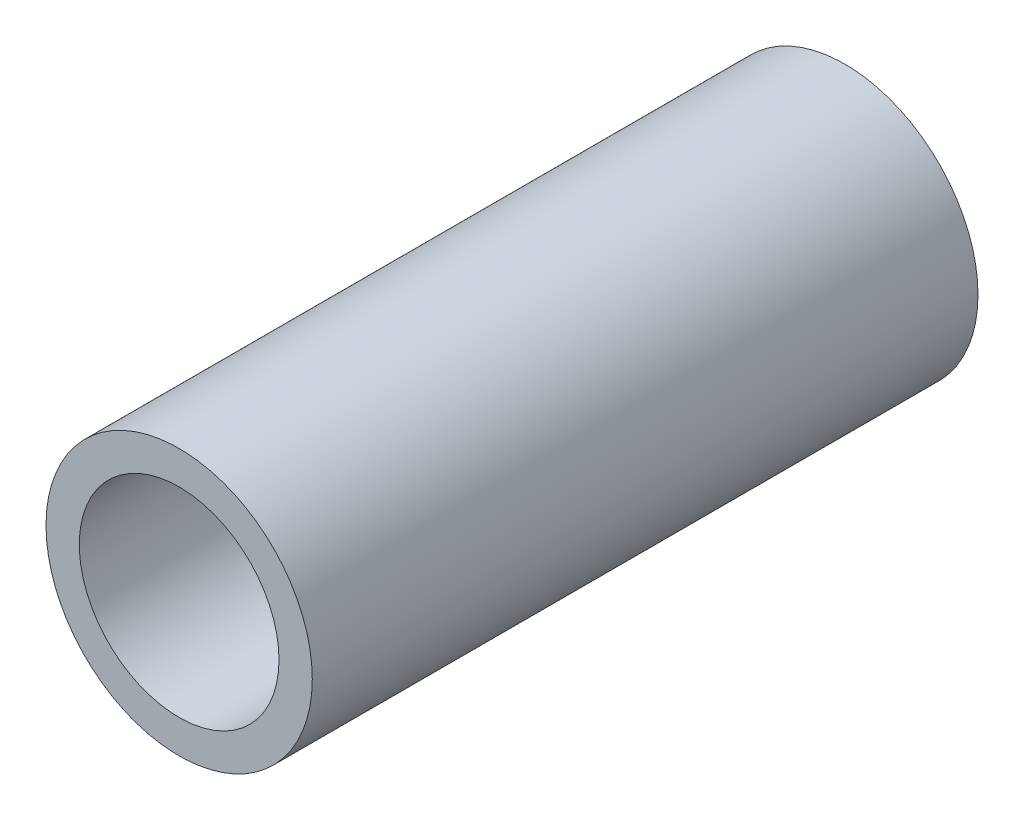
ISO-10303-21;
HEADER;
FILE_DESCRIPTION(('STEP AP214'),'2;1');
FILE_NAME('part.step','',(''),(''),'','','');
FILE_SCHEMA(('AUTOMOTIVE_DESIGN { 1 0 10303 214 1 1 1 1 }'));
ENDSEC;
DATA;
#1=APPLICATION_CONTEXT('core data for automotive mechanical design processes');
#2=APPLICATION_PROTOCOL_DEFINITION('international standard','automotive_design',2000,#1);
#3=PRODUCT_CONTEXT('',#1,'mechanical');
#4=PRODUCT('Part','Part','',(#3));
#5=PRODUCT_RELATED_PRODUCT_CATEGORY('part','',(#4));
#6=PRODUCT_DEFINITION_FORMATION('','',#4);
#7=PRODUCT_DEFINITION_CONTEXT('part definition',#1,'design');
#8=PRODUCT_DEFINITION('design','',#6,#7);
#9=PRODUCT_DEFINITION_SHAPE('','',#8);
#10=(LENGTH_UNIT() NAMED_UNIT(*) SI_UNIT(.MILLI.,.METRE.));
#11=(NAMED_UNIT(*) PLANE_ANGLE_UNIT() SI_UNIT($,.RADIAN.));
#12=(NAMED_UNIT(*) SI_UNIT($,.STERADIAN.) SOLID_ANGLE_UNIT());
#13=UNCERTAINTY_MEASURE_WITH_UNIT(LENGTH_MEASURE(1.E-05),#10,'distance_accuracy_value','');
#14=(GEOMETRIC_REPRESENTATION_CONTEXT(3) GLOBAL_UNCERTAINTY_ASSIGNED_CONTEXT((#13)) GLOBAL_UNIT_ASSIGNED_CONTEXT((#10,
#11,#12)) REPRESENTATION_CONTEXT('',''));
#15=CARTESIAN_POINT('',(0.,0.,0.));
#16=DIRECTION('',(0.,0.,1.));
#17=DIRECTION('',(1.,0.,0.));
#18=AXIS2_PLACEMENT_3D('',#15,#16,#17);
#19=CARTESIAN_POINT('',(21.0196381560286,112.414161958909,343.624757540734));
#20=DIRECTION('',(0.,0.,-1.));
#21=DIRECTION('',(0.,-1.,0.));
#22=AXIS2_PLACEMENT_3D('',#19,#20,#21);
#23=PLANE('',#22);
#24=CARTESIAN_POINT('',(21.0196381560286,112.414161958909,343.624757540734));
#25=DIRECTION('',(0.,0.,1.));
#26=DIRECTION('',(1.,0.,0.));
#27=AXIS2_PLACEMENT_3D('',#24,#25,#26);
#28=CIRCLE('',#27,3.);
#29=CARTESIAN_POINT('',(24.0196381560286,112.414161958909,343.624757540734));
#30=VERTEX_POINT('',#29);
#31=EDGE_CURVE('E11',#30,#30,#28,.T.);
#32=ORIENTED_EDGE('',*,*,#31,.T.);
#33=EDGE_LOOP('',(#32));
#34=FACE_BOUND('',#33,.T.);
#35=CARTESIAN_POINT('',(21.0196381560286,112.414161958909,343.624757540734));
#36=DIRECTION('',(0.,0.,1.));
#37=DIRECTION('',(1.,0.,0.));
#38=AXIS2_PLACEMENT_3D('',#35,#36,#37);
#39=CIRCLE('',#38,4.);
#40=CARTESIAN_POINT('',(25.0196381560286,112.414161958909,343.624757540734));
#41=VERTEX_POINT('',#40);
#42=EDGE_CURVE('E47',#41,#41,#39,.T.);
#43=ORIENTED_EDGE('',*,*,#42,.F.);
#44=EDGE_LOOP('',(#43));
#45=FACE_BOUND('',#44,.T.);
#46=ADVANCED_FACE('F43',(#34,#45),#23,.T.);
#47=CARTESIAN_POINT('',(21.0196381560286,112.414161958909,363.624757540734));
#48=DIRECTION('',(0.,0.,-1.));
#49=DIRECTION('',(0.,-1.,0.));
#50=AXIS2_PLACEMENT_3D('',#47,#48,#49);
#51=PLANE('',#50);
#52=CARTESIAN_POINT('',(21.0196381560286,112.414161958909,363.624757540734));
#53=DIRECTION('',(0.,0.,1.));
#54=DIRECTION('',(1.,0.,0.));
#55=AXIS2_PLACEMENT_3D('',#52,#53,#54);
#56=CIRCLE('',#55,3.);
#57=CARTESIAN_POINT('',(24.0196381560286,112.414161958909,363.624757540734));
#58=VERTEX_POINT('',#57);
#59=EDGE_CURVE('E53',#58,#58,#56,.T.);
#60=ORIENTED_EDGE('',*,*,#59,.F.);
#61=EDGE_LOOP('',(#60));
#62=FACE_BOUND('',#61,.T.);
#63=CARTESIAN_POINT('',(21.0196381560286,112.414161958909,363.624757540734));
#64=DIRECTION('',(0.,0.,1.));
#65=DIRECTION('',(1.,0.,0.));
#66=AXIS2_PLACEMENT_3D('',#63,#64,#65);
#67=CIRCLE('',#66,4.);
#68=CARTESIAN_POINT('',(25.0196381560286,112.414161958909,363.624757540734));
#69=VERTEX_POINT('',#68);
#70=EDGE_CURVE('E65',#69,#69,#67,.T.);
#71=ORIENTED_EDGE('',*,*,#70,.T.);
#72=EDGE_LOOP('',(#71));
#73=FACE_BOUND('',#72,.T.);
#74=ADVANCED_FACE('F76',(#62,#73),#51,.F.);
#75=CARTESIAN_POINT('',(21.0196381560286,112.414161958909,363.624757540734));
#76=DIRECTION('',(0.,0.,-1.));
#77=DIRECTION('',(1.,0.,0.));
#78=AXIS2_PLACEMENT_3D('',#75,#76,#77);
#79=CYLINDRICAL_SURFACE('',#78,3.);
#80=ORIENTED_EDGE('',*,*,#31,.F.);
#81=EDGE_LOOP('',(#80));
#82=FACE_BOUND('',#81,.T.);
#83=ORIENTED_EDGE('',*,*,#59,.T.);
#84=EDGE_LOOP('',(#83));
#85=FACE_BOUND('',#84,.T.);
#86=ADVANCED_FACE('F74',(#82,#85),#79,.F.);
#87=CARTESIAN_POINT('',(21.0196381560286,112.414161958909,363.624757540734));
#88=DIRECTION('',(0.,0.,-1.));
#89=DIRECTION('',(1.,0.,0.));
#90=AXIS2_PLACEMENT_3D('',#87,#88,#89);
#91=CYLINDRICAL_SURFACE('',#90,4.);
#92=ORIENTED_EDGE('',*,*,#42,.T.);
#93=EDGE_LOOP('',(#92));
#94=FACE_BOUND('',#93,.T.);
#95=ORIENTED_EDGE('',*,*,#70,.F.);
#96=EDGE_LOOP('',(#95));
#97=FACE_BOUND('',#96,.T.);
#98=ADVANCED_FACE('F45',(#94,#97),#91,.T.);
#99=CLOSED_SHELL('',(#46,#74,#86,#98));
#100=MANIFOLD_SOLID_BREP('B2',#99);
#101=ADVANCED_BREP_SHAPE_REPRESENTATION('',(#18,#100),#14);
#102=SHAPE_DEFINITION_REPRESENTATION(#9,#101);
ENDSEC;
END-ISO-10303-21;
